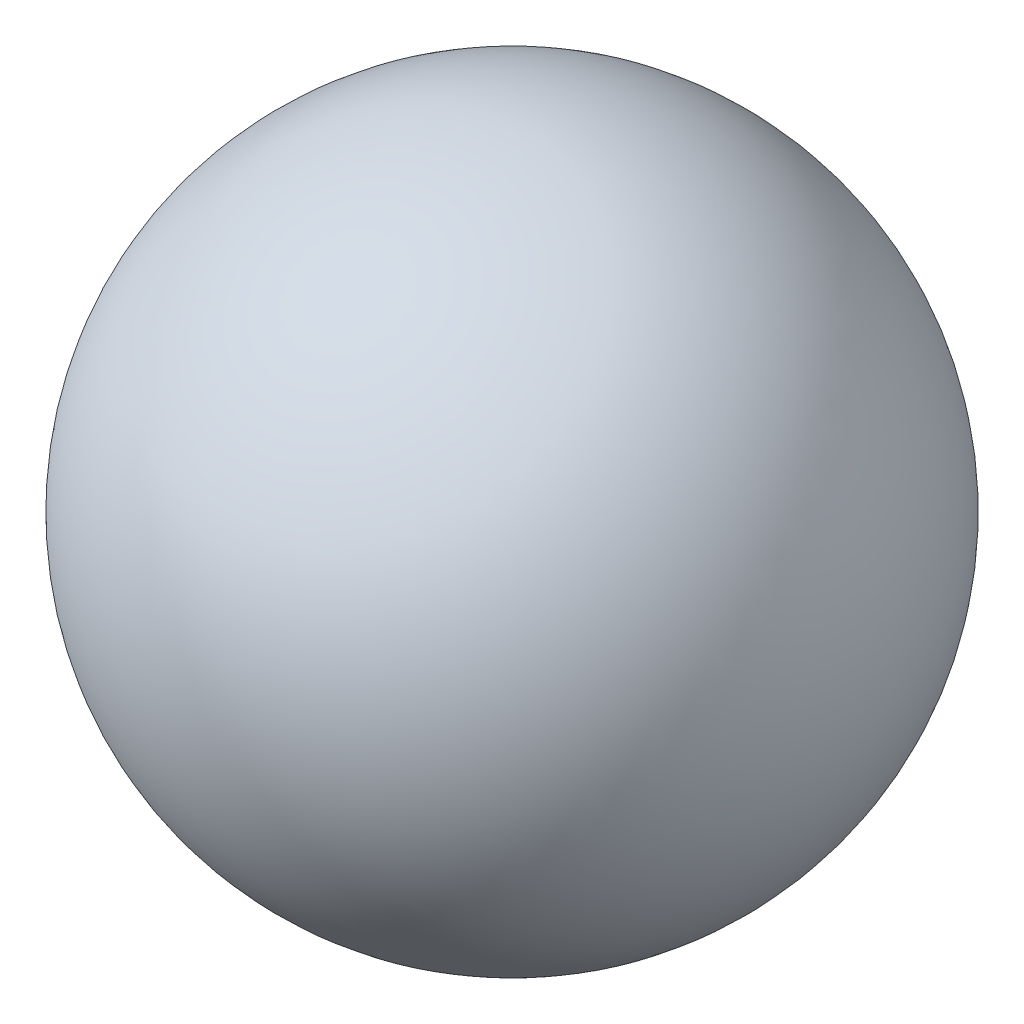
ISO-10303-21;
HEADER;
FILE_DESCRIPTION(('STEP AP214'),'2;1');
FILE_NAME('part.step','',(''),(''),'','','');
FILE_SCHEMA(('AUTOMOTIVE_DESIGN { 1 0 10303 214 1 1 1 1 }'));
ENDSEC;
DATA;
#1=APPLICATION_CONTEXT('core data for automotive mechanical design processes');
#2=APPLICATION_PROTOCOL_DEFINITION('international standard','automotive_design',2000,#1);
#3=PRODUCT_CONTEXT('',#1,'mechanical');
#4=PRODUCT('Part','Part','',(#3));
#5=PRODUCT_RELATED_PRODUCT_CATEGORY('part','',(#4));
#6=PRODUCT_DEFINITION_FORMATION('','',#4);
#7=PRODUCT_DEFINITION_CONTEXT('part definition',#1,'design');
#8=PRODUCT_DEFINITION('design','',#6,#7);
#9=PRODUCT_DEFINITION_SHAPE('','',#8);
#10=(LENGTH_UNIT() NAMED_UNIT(*) SI_UNIT(.MILLI.,.METRE.));
#11=(NAMED_UNIT(*) PLANE_ANGLE_UNIT() SI_UNIT($,.RADIAN.));
#12=(NAMED_UNIT(*) SI_UNIT($,.STERADIAN.) SOLID_ANGLE_UNIT());
#13=UNCERTAINTY_MEASURE_WITH_UNIT(LENGTH_MEASURE(1.E-05),#10,'distance_accuracy_value','');
#14=(GEOMETRIC_REPRESENTATION_CONTEXT(3) GLOBAL_UNCERTAINTY_ASSIGNED_CONTEXT((#13)) GLOBAL_UNIT_ASSIGNED_CONTEXT((#10,
#11,#12)) REPRESENTATION_CONTEXT('',''));
#15=CARTESIAN_POINT('',(0.,0.,0.));
#16=DIRECTION('',(0.,0.,1.));
#17=DIRECTION('',(1.,0.,0.));
#18=AXIS2_PLACEMENT_3D('',#15,#16,#17);
#19=CARTESIAN_POINT('',(0.,0.,0.));
#20=DIRECTION('',(0.,1.,0.));
#21=DIRECTION('',(1.,0.,0.));
#22=AXIS2_PLACEMENT_3D('',#19,#20,#21);
#23=SPHERICAL_SURFACE('',#22,50.8);
#24=CARTESIAN_POINT('',(0.,50.8,0.));
#25=VERTEX_POINT('',#24);
#26=VERTEX_LOOP('',#25);
#27=FACE_BOUND('',#26,.T.);
#28=ADVANCED_FACE('F31',(#27),#23,.T.);
#29=CLOSED_SHELL('',(#28));
#30=MANIFOLD_SOLID_BREP('B2',#29);
#31=ADVANCED_BREP_SHAPE_REPRESENTATION('',(#18,#30),#14);
#32=SHAPE_DEFINITION_REPRESENTATION(#9,#31);
ENDSEC;
END-ISO-10303-21;
